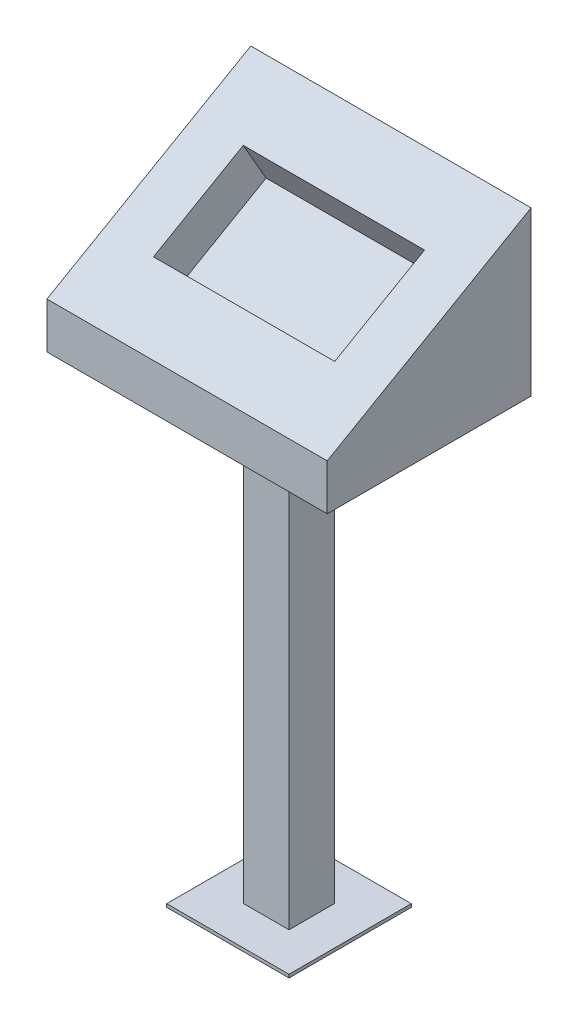
ISO-10303-21;
HEADER;
FILE_DESCRIPTION(('STEP AP214'),'2;1');
FILE_NAME('part.step','',(''),(''),'','','');
FILE_SCHEMA(('AUTOMOTIVE_DESIGN { 1 0 10303 214 1 1 1 1 }'));
ENDSEC;
DATA;
#1=APPLICATION_CONTEXT('core data for automotive mechanical design processes');
#2=APPLICATION_PROTOCOL_DEFINITION('international standard','automotive_design',2000,#1);
#3=PRODUCT_CONTEXT('',#1,'mechanical');
#4=PRODUCT('Part','Part','',(#3));
#5=PRODUCT_RELATED_PRODUCT_CATEGORY('part','',(#4));
#6=PRODUCT_DEFINITION_FORMATION('','',#4);
#7=PRODUCT_DEFINITION_CONTEXT('part definition',#1,'design');
#8=PRODUCT_DEFINITION('design','',#6,#7);
#9=PRODUCT_DEFINITION_SHAPE('','',#8);
#10=(LENGTH_UNIT() NAMED_UNIT(*) SI_UNIT(.MILLI.,.METRE.));
#11=(NAMED_UNIT(*) PLANE_ANGLE_UNIT() SI_UNIT($,.RADIAN.));
#12=(NAMED_UNIT(*) SI_UNIT($,.STERADIAN.) SOLID_ANGLE_UNIT());
#13=UNCERTAINTY_MEASURE_WITH_UNIT(LENGTH_MEASURE(1.E-05),#10,'distance_accuracy_value','');
#14=(GEOMETRIC_REPRESENTATION_CONTEXT(3) GLOBAL_UNCERTAINTY_ASSIGNED_CONTEXT((#13)) GLOBAL_UNIT_ASSIGNED_CONTEXT((#10,
#11,#12)) REPRESENTATION_CONTEXT('',''));
#15=CARTESIAN_POINT('',(0.,0.,0.));
#16=DIRECTION('',(0.,0.,1.));
#17=DIRECTION('',(1.,0.,0.));
#18=AXIS2_PLACEMENT_3D('',#15,#16,#17);
#19=CARTESIAN_POINT('',(0.,6.35,0.));
#20=DIRECTION('',(0.,-1.,0.));
#21=DIRECTION('',(0.,0.,-1.));
#22=AXIS2_PLACEMENT_3D('',#19,#20,#21);
#23=PLANE('',#22);
#24=DIRECTION('',(0.,0.,1.));
#25=VECTOR('',#24,1.);
#26=CARTESIAN_POINT('',(0.,6.35,0.));
#27=LINE('',#26,#25);
#28=CARTESIAN_POINT('',(0.,6.35,-240.));
#29=VERTEX_POINT('',#28);
#30=CARTESIAN_POINT('',(0.,6.35,0.));
#31=VERTEX_POINT('',#30);
#32=EDGE_CURVE('E251',#29,#31,#27,.T.);
#33=ORIENTED_EDGE('',*,*,#32,.T.);
#34=DIRECTION('',(1.,0.,0.));
#35=VECTOR('',#34,1.);
#36=CARTESIAN_POINT('',(0.,6.35,0.));
#37=LINE('',#36,#35);
#38=CARTESIAN_POINT('',(240.,6.35,0.));
#39=VERTEX_POINT('',#38);
#40=EDGE_CURVE('E254',#31,#39,#37,.T.);
#41=ORIENTED_EDGE('',*,*,#40,.T.);
#42=DIRECTION('',(0.,0.,-1.));
#43=VECTOR('',#42,1.);
#44=CARTESIAN_POINT('',(240.,6.35,0.));
#45=LINE('',#44,#43);
#46=CARTESIAN_POINT('',(240.,6.35,-240.));
#47=VERTEX_POINT('',#46);
#48=EDGE_CURVE('E257',#39,#47,#45,.T.);
#49=ORIENTED_EDGE('',*,*,#48,.T.);
#50=DIRECTION('',(-1.,0.,0.));
#51=VECTOR('',#50,1.);
#52=CARTESIAN_POINT('',(0.,6.35,-240.));
#53=LINE('',#52,#51);
#54=EDGE_CURVE('E259',#47,#29,#53,.T.);
#55=ORIENTED_EDGE('',*,*,#54,.T.);
#56=EDGE_LOOP('',(#33,#41,#49,#55));
#57=FACE_BOUND('',#56,.T.);
#58=DIRECTION('',(0.,0.,1.));
#59=VECTOR('',#58,1.);
#60=CARTESIAN_POINT('',(75.55,6.35,-75.55));
#61=LINE('',#60,#59);
#62=CARTESIAN_POINT('',(75.55,6.35,-164.45));
#63=VERTEX_POINT('',#62);
#64=CARTESIAN_POINT('',(75.55,6.35,-75.55));
#65=VERTEX_POINT('',#64);
#66=EDGE_CURVE('E217',#63,#65,#61,.T.);
#67=ORIENTED_EDGE('',*,*,#66,.F.);
#68=DIRECTION('',(-1.,0.,0.));
#69=VECTOR('',#68,1.);
#70=CARTESIAN_POINT('',(164.45,6.35,-164.45));
#71=LINE('',#70,#69);
#72=CARTESIAN_POINT('',(164.45,6.35,-164.45));
#73=VERTEX_POINT('',#72);
#74=EDGE_CURVE('E222',#73,#63,#71,.T.);
#75=ORIENTED_EDGE('',*,*,#74,.F.);
#76=DIRECTION('',(0.,0.,-1.));
#77=VECTOR('',#76,1.);
#78=CARTESIAN_POINT('',(164.45,6.35,-75.55));
#79=LINE('',#78,#77);
#80=CARTESIAN_POINT('',(164.45,6.35,-75.55));
#81=VERTEX_POINT('',#80);
#82=EDGE_CURVE('E235',#81,#73,#79,.T.);
#83=ORIENTED_EDGE('',*,*,#82,.F.);
#84=DIRECTION('',(1.,0.,0.));
#85=VECTOR('',#84,1.);
#86=CARTESIAN_POINT('',(164.45,6.35,-75.55));
#87=LINE('',#86,#85);
#88=EDGE_CURVE('E59',#65,#81,#87,.T.);
#89=ORIENTED_EDGE('',*,*,#88,.F.);
#90=EDGE_LOOP('',(#67,#75,#83,#89));
#91=FACE_BOUND('',#90,.T.);
#92=ADVANCED_FACE('F36',(#57,#91),#23,.F.);
#93=CARTESIAN_POINT('',(0.,6.35,0.));
#94=DIRECTION('',(1.,0.,0.));
#95=DIRECTION('',(0.,0.,-1.));
#96=AXIS2_PLACEMENT_3D('',#93,#94,#95);
#97=PLANE('',#96);
#98=DIRECTION('',(0.,0.,1.));
#99=VECTOR('',#98,1.);
#100=CARTESIAN_POINT('',(0.,0.,0.));
#101=LINE('',#100,#99);
#102=CARTESIAN_POINT('',(0.,0.,-240.));
#103=VERTEX_POINT('',#102);
#104=CARTESIAN_POINT('',(0.,0.,0.));
#105=VERTEX_POINT('',#104);
#106=EDGE_CURVE('E250',#103,#105,#101,.T.);
#107=ORIENTED_EDGE('',*,*,#106,.T.);
#108=DIRECTION('',(0.,-1.,0.));
#109=VECTOR('',#108,1.);
#110=CARTESIAN_POINT('',(0.,6.35,0.));
#111=LINE('',#110,#109);
#112=EDGE_CURVE('E11',#31,#105,#111,.T.);
#113=ORIENTED_EDGE('',*,*,#112,.F.);
#114=ORIENTED_EDGE('',*,*,#32,.F.);
#115=DIRECTION('',(0.,-1.,0.));
#116=VECTOR('',#115,1.);
#117=CARTESIAN_POINT('',(0.,6.35,-240.));
#118=LINE('',#117,#116);
#119=EDGE_CURVE('E261',#29,#103,#118,.T.);
#120=ORIENTED_EDGE('',*,*,#119,.T.);
#121=EDGE_LOOP('',(#107,#113,#114,#120));
#122=FACE_BOUND('',#121,.T.);
#123=ADVANCED_FACE('F38',(#122),#97,.F.);
#124=CARTESIAN_POINT('',(0.,6.35,0.));
#125=DIRECTION('',(0.,0.,-1.));
#126=DIRECTION('',(-1.,0.,0.));
#127=AXIS2_PLACEMENT_3D('',#124,#125,#126);
#128=PLANE('',#127);
#129=DIRECTION('',(1.,0.,0.));
#130=VECTOR('',#129,1.);
#131=CARTESIAN_POINT('',(0.,0.,0.));
#132=LINE('',#131,#130);
#133=CARTESIAN_POINT('',(240.,0.,0.));
#134=VERTEX_POINT('',#133);
#135=EDGE_CURVE('E264',#105,#134,#132,.T.);
#136=ORIENTED_EDGE('',*,*,#135,.T.);
#137=DIRECTION('',(0.,-1.,0.));
#138=VECTOR('',#137,1.);
#139=CARTESIAN_POINT('',(240.,6.35,0.));
#140=LINE('',#139,#138);
#141=EDGE_CURVE('E44',#39,#134,#140,.T.);
#142=ORIENTED_EDGE('',*,*,#141,.F.);
#143=ORIENTED_EDGE('',*,*,#40,.F.);
#144=ORIENTED_EDGE('',*,*,#112,.T.);
#145=EDGE_LOOP('',(#136,#142,#143,#144));
#146=FACE_BOUND('',#145,.T.);
#147=ADVANCED_FACE('F293',(#146),#128,.F.);
#148=CARTESIAN_POINT('',(240.,6.35,0.));
#149=DIRECTION('',(-1.,0.,0.));
#150=DIRECTION('',(0.,0.,1.));
#151=AXIS2_PLACEMENT_3D('',#148,#149,#150);
#152=PLANE('',#151);
#153=DIRECTION('',(0.,0.,-1.));
#154=VECTOR('',#153,1.);
#155=CARTESIAN_POINT('',(240.,0.,0.));
#156=LINE('',#155,#154);
#157=CARTESIAN_POINT('',(240.,0.,-240.));
#158=VERTEX_POINT('',#157);
#159=EDGE_CURVE('E266',#134,#158,#156,.T.);
#160=ORIENTED_EDGE('',*,*,#159,.T.);
#161=DIRECTION('',(0.,-1.,0.));
#162=VECTOR('',#161,1.);
#163=CARTESIAN_POINT('',(240.,6.35,-240.));
#164=LINE('',#163,#162);
#165=EDGE_CURVE('E271',#47,#158,#164,.T.);
#166=ORIENTED_EDGE('',*,*,#165,.F.);
#167=ORIENTED_EDGE('',*,*,#48,.F.);
#168=ORIENTED_EDGE('',*,*,#141,.T.);
#169=EDGE_LOOP('',(#160,#166,#167,#168));
#170=FACE_BOUND('',#169,.T.);
#171=ADVANCED_FACE('F278',(#170),#152,.F.);
#172=CARTESIAN_POINT('',(0.,6.35,-240.));
#173=DIRECTION('',(0.,0.,1.));
#174=DIRECTION('',(1.,0.,0.));
#175=AXIS2_PLACEMENT_3D('',#172,#173,#174);
#176=PLANE('',#175);
#177=DIRECTION('',(-1.,0.,0.));
#178=VECTOR('',#177,1.);
#179=CARTESIAN_POINT('',(0.,0.,-240.));
#180=LINE('',#179,#178);
#181=EDGE_CURVE('E255',#158,#103,#180,.T.);
#182=ORIENTED_EDGE('',*,*,#181,.T.);
#183=ORIENTED_EDGE('',*,*,#119,.F.);
#184=ORIENTED_EDGE('',*,*,#54,.F.);
#185=ORIENTED_EDGE('',*,*,#165,.T.);
#186=EDGE_LOOP('',(#182,#183,#184,#185));
#187=FACE_BOUND('',#186,.T.);
#188=ADVANCED_FACE('F287',(#187),#176,.F.);
#189=CARTESIAN_POINT('',(0.,0.,0.));
#190=DIRECTION('',(0.,-1.,0.));
#191=DIRECTION('',(0.,0.,-1.));
#192=AXIS2_PLACEMENT_3D('',#189,#190,#191);
#193=PLANE('',#192);
#194=ORIENTED_EDGE('',*,*,#106,.F.);
#195=ORIENTED_EDGE('',*,*,#181,.F.);
#196=ORIENTED_EDGE('',*,*,#159,.F.);
#197=ORIENTED_EDGE('',*,*,#135,.F.);
#198=EDGE_LOOP('',(#194,#195,#196,#197));
#199=FACE_BOUND('',#198,.T.);
#200=ADVANCED_FACE('F284',(#199),#193,.T.);
#201=CARTESIAN_POINT('',(75.55,906.35,-75.55));
#202=DIRECTION('',(1.,0.,0.));
#203=DIRECTION('',(0.,0.,-1.));
#204=AXIS2_PLACEMENT_3D('',#201,#202,#203);
#205=PLANE('',#204);
#206=ORIENTED_EDGE('',*,*,#66,.T.);
#207=DIRECTION('',(0.,-1.,0.));
#208=VECTOR('',#207,1.);
#209=CARTESIAN_POINT('',(75.55,906.35,-75.55));
#210=LINE('',#209,#208);
#211=CARTESIAN_POINT('',(75.55,906.35,-75.55));
#212=VERTEX_POINT('',#211);
#213=EDGE_CURVE('E248',#212,#65,#210,.T.);
#214=ORIENTED_EDGE('',*,*,#213,.F.);
#215=DIRECTION('',(0.,0.,1.));
#216=VECTOR('',#215,1.);
#217=CARTESIAN_POINT('',(75.55,906.35,-75.55));
#218=LINE('',#217,#216);
#219=CARTESIAN_POINT('',(75.55,906.35,-164.45));
#220=VERTEX_POINT('',#219);
#221=EDGE_CURVE('E218',#220,#212,#218,.T.);
#222=ORIENTED_EDGE('',*,*,#221,.F.);
#223=DIRECTION('',(0.,-1.,0.));
#224=VECTOR('',#223,1.);
#225=CARTESIAN_POINT('',(75.55,906.35,-164.45));
#226=LINE('',#225,#224);
#227=EDGE_CURVE('E231',#220,#63,#226,.T.);
#228=ORIENTED_EDGE('',*,*,#227,.T.);
#229=EDGE_LOOP('',(#206,#214,#222,#228));
#230=FACE_BOUND('',#229,.T.);
#231=ADVANCED_FACE('F306',(#230),#205,.F.);
#232=CARTESIAN_POINT('',(164.45,906.35,-75.55));
#233=DIRECTION('',(0.,0.,-1.));
#234=DIRECTION('',(-1.,0.,0.));
#235=AXIS2_PLACEMENT_3D('',#232,#233,#234);
#236=PLANE('',#235);
#237=ORIENTED_EDGE('',*,*,#88,.T.);
#238=DIRECTION('',(0.,-1.,0.));
#239=VECTOR('',#238,1.);
#240=CARTESIAN_POINT('',(164.45,906.35,-75.55));
#241=LINE('',#240,#239);
#242=CARTESIAN_POINT('',(164.45,906.35,-75.55));
#243=VERTEX_POINT('',#242);
#244=EDGE_CURVE('E245',#243,#81,#241,.T.);
#245=ORIENTED_EDGE('',*,*,#244,.F.);
#246=DIRECTION('',(1.,0.,0.));
#247=VECTOR('',#246,1.);
#248=CARTESIAN_POINT('',(164.45,906.35,-75.55));
#249=LINE('',#248,#247);
#250=EDGE_CURVE('E221',#212,#243,#249,.T.);
#251=ORIENTED_EDGE('',*,*,#250,.F.);
#252=ORIENTED_EDGE('',*,*,#213,.T.);
#253=EDGE_LOOP('',(#237,#245,#251,#252));
#254=FACE_BOUND('',#253,.T.);
#255=ADVANCED_FACE('F325',(#254),#236,.F.);
#256=CARTESIAN_POINT('',(164.45,906.35,-75.55));
#257=DIRECTION('',(-1.,0.,0.));
#258=DIRECTION('',(0.,0.,1.));
#259=AXIS2_PLACEMENT_3D('',#256,#257,#258);
#260=PLANE('',#259);
#261=ORIENTED_EDGE('',*,*,#82,.T.);
#262=DIRECTION('',(0.,-1.,0.));
#263=VECTOR('',#262,1.);
#264=CARTESIAN_POINT('',(164.45,906.35,-164.45));
#265=LINE('',#264,#263);
#266=CARTESIAN_POINT('',(164.45,906.35,-164.45));
#267=VERTEX_POINT('',#266);
#268=EDGE_CURVE('E242',#267,#73,#265,.T.);
#269=ORIENTED_EDGE('',*,*,#268,.F.);
#270=DIRECTION('',(0.,0.,-1.));
#271=VECTOR('',#270,1.);
#272=CARTESIAN_POINT('',(164.45,906.35,-75.55));
#273=LINE('',#272,#271);
#274=EDGE_CURVE('E225',#243,#267,#273,.T.);
#275=ORIENTED_EDGE('',*,*,#274,.F.);
#276=ORIENTED_EDGE('',*,*,#244,.T.);
#277=EDGE_LOOP('',(#261,#269,#275,#276));
#278=FACE_BOUND('',#277,.T.);
#279=ADVANCED_FACE('F332',(#278),#260,.F.);
#280=CARTESIAN_POINT('',(164.45,906.35,-164.45));
#281=DIRECTION('',(0.,0.,1.));
#282=DIRECTION('',(1.,0.,0.));
#283=AXIS2_PLACEMENT_3D('',#280,#281,#282);
#284=PLANE('',#283);
#285=ORIENTED_EDGE('',*,*,#74,.T.);
#286=ORIENTED_EDGE('',*,*,#227,.F.);
#287=DIRECTION('',(-1.,0.,0.));
#288=VECTOR('',#287,1.);
#289=CARTESIAN_POINT('',(164.45,906.35,-164.45));
#290=LINE('',#289,#288);
#291=EDGE_CURVE('E228',#267,#220,#290,.T.);
#292=ORIENTED_EDGE('',*,*,#291,.F.);
#293=ORIENTED_EDGE('',*,*,#268,.T.);
#294=EDGE_LOOP('',(#285,#286,#292,#293));
#295=FACE_BOUND('',#294,.T.);
#296=ADVANCED_FACE('F339',(#295),#284,.F.);
#297=CARTESIAN_POINT('',(0.,906.35,0.));
#298=DIRECTION('',(0.,-1.,0.));
#299=DIRECTION('',(0.,0.,-1.));
#300=AXIS2_PLACEMENT_3D('',#297,#298,#299);
#301=PLANE('',#300);
#302=DIRECTION('',(0.,0.,-1.));
#303=VECTOR('',#302,1.);
#304=CARTESIAN_POINT('',(395.,906.35,80.));
#305=LINE('',#304,#303);
#306=CARTESIAN_POINT('',(395.,906.35,80.));
#307=VERTEX_POINT('',#306);
#308=CARTESIAN_POINT('',(395.,906.35,-320.));
#309=VERTEX_POINT('',#308);
#310=EDGE_CURVE('E194',#307,#309,#305,.T.);
#311=ORIENTED_EDGE('',*,*,#310,.F.);
#312=DIRECTION('',(1.,0.,0.));
#313=VECTOR('',#312,1.);
#314=CARTESIAN_POINT('',(-155.,906.35,80.));
#315=LINE('',#314,#313);
#316=CARTESIAN_POINT('',(-155.,906.35,80.));
#317=VERTEX_POINT('',#316);
#318=EDGE_CURVE('E198',#317,#307,#315,.T.);
#319=ORIENTED_EDGE('',*,*,#318,.F.);
#320=DIRECTION('',(0.,0.,1.));
#321=VECTOR('',#320,1.);
#322=CARTESIAN_POINT('',(-155.,906.35,80.));
#323=LINE('',#322,#321);
#324=CARTESIAN_POINT('',(-155.,906.35,-320.));
#325=VERTEX_POINT('',#324);
#326=EDGE_CURVE('E203',#325,#317,#323,.T.);
#327=ORIENTED_EDGE('',*,*,#326,.F.);
#328=DIRECTION('',(-1.,0.,0.));
#329=VECTOR('',#328,1.);
#330=CARTESIAN_POINT('',(-155.,906.35,-320.));
#331=LINE('',#330,#329);
#332=EDGE_CURVE('E201',#309,#325,#331,.T.);
#333=ORIENTED_EDGE('',*,*,#332,.F.);
#334=EDGE_LOOP('',(#311,#319,#327,#333));
#335=FACE_BOUND('',#334,.T.);
#336=ORIENTED_EDGE('',*,*,#221,.T.);
#337=ORIENTED_EDGE('',*,*,#250,.T.);
#338=ORIENTED_EDGE('',*,*,#274,.T.);
#339=ORIENTED_EDGE('',*,*,#291,.T.);
#340=EDGE_LOOP('',(#336,#337,#338,#339));
#341=FACE_BOUND('',#340,.T.);
#342=ADVANCED_FACE('F347',(#335,#341),#301,.T.);
#343=CARTESIAN_POINT('',(395.,1226.35,80.));
#344=DIRECTION('',(-1.,0.,0.));
#345=DIRECTION('',(0.,0.,1.));
#346=AXIS2_PLACEMENT_3D('',#343,#344,#345);
#347=PLANE('',#346);
#348=DIRECTION('',(0.,-1.,0.));
#349=VECTOR('',#348,1.);
#350=CARTESIAN_POINT('',(395.,1226.35,-320.));
#351=LINE('',#350,#349);
#352=CARTESIAN_POINT('',(395.,1226.35,-320.));
#353=VERTEX_POINT('',#352);
#354=EDGE_CURVE('E214',#353,#309,#351,.T.);
#355=ORIENTED_EDGE('',*,*,#354,.F.);
#356=DIRECTION('',(0.,0.498471124258083,-0.866906303057535));
#357=VECTOR('',#356,1.);
#358=CARTESIAN_POINT('',(395.,1226.35,-320.));
#359=LINE('',#358,#357);
#360=CARTESIAN_POINT('',(395.,996.35,80.));
#361=VERTEX_POINT('',#360);
#362=EDGE_CURVE('E192',#361,#353,#359,.T.);
#363=ORIENTED_EDGE('',*,*,#362,.F.);
#364=DIRECTION('',(0.,-1.,0.));
#365=VECTOR('',#364,1.);
#366=CARTESIAN_POINT('',(395.,1226.35,80.));
#367=LINE('',#366,#365);
#368=EDGE_CURVE('E197',#361,#307,#367,.T.);
#369=ORIENTED_EDGE('',*,*,#368,.T.);
#370=ORIENTED_EDGE('',*,*,#310,.T.);
#371=EDGE_LOOP('',(#355,#363,#369,#370));
#372=FACE_BOUND('',#371,.T.);
#373=ADVANCED_FACE('F355',(#372),#347,.F.);
#374=CARTESIAN_POINT('',(-155.,1226.35,-320.));
#375=DIRECTION('',(0.,0.,1.));
#376=DIRECTION('',(1.,0.,0.));
#377=AXIS2_PLACEMENT_3D('',#374,#375,#376);
#378=PLANE('',#377);
#379=ORIENTED_EDGE('',*,*,#332,.T.);
#380=DIRECTION('',(0.,-1.,0.));
#381=VECTOR('',#380,1.);
#382=CARTESIAN_POINT('',(-155.,1226.35,-320.));
#383=LINE('',#382,#381);
#384=CARTESIAN_POINT('',(-155.,1226.35,-320.));
#385=VERTEX_POINT('',#384);
#386=EDGE_CURVE('E211',#385,#325,#383,.T.);
#387=ORIENTED_EDGE('',*,*,#386,.F.);
#388=DIRECTION('',(-1.,0.,0.));
#389=VECTOR('',#388,1.);
#390=CARTESIAN_POINT('',(-155.,1226.35,-320.));
#391=LINE('',#390,#389);
#392=EDGE_CURVE('E195',#353,#385,#391,.T.);
#393=ORIENTED_EDGE('',*,*,#392,.F.);
#394=ORIENTED_EDGE('',*,*,#354,.T.);
#395=EDGE_LOOP('',(#379,#387,#393,#394));
#396=FACE_BOUND('',#395,.T.);
#397=ADVANCED_FACE('F363',(#396),#378,.F.);
#398=CARTESIAN_POINT('',(-155.,1226.35,80.));
#399=DIRECTION('',(1.,0.,0.));
#400=DIRECTION('',(0.,0.,-1.));
#401=AXIS2_PLACEMENT_3D('',#398,#399,#400);
#402=PLANE('',#401);
#403=DIRECTION('',(0.,-1.,0.));
#404=VECTOR('',#403,1.);
#405=CARTESIAN_POINT('',(-155.,1226.35,80.));
#406=LINE('',#405,#404);
#407=CARTESIAN_POINT('',(-155.,996.35,80.));
#408=VERTEX_POINT('',#407);
#409=EDGE_CURVE('E209',#408,#317,#406,.T.);
#410=ORIENTED_EDGE('',*,*,#409,.F.);
#411=DIRECTION('',(0.,-0.498471124258083,0.866906303057535));
#412=VECTOR('',#411,1.);
#413=CARTESIAN_POINT('',(-155.,1226.35,-320.));
#414=LINE('',#413,#412);
#415=EDGE_CURVE('E184',#385,#408,#414,.T.);
#416=ORIENTED_EDGE('',*,*,#415,.F.);
#417=ORIENTED_EDGE('',*,*,#386,.T.);
#418=ORIENTED_EDGE('',*,*,#326,.T.);
#419=EDGE_LOOP('',(#410,#416,#417,#418));
#420=FACE_BOUND('',#419,.T.);
#421=ADVANCED_FACE('F371',(#420),#402,.F.);
#422=CARTESIAN_POINT('',(-155.,1226.35,80.));
#423=DIRECTION('',(0.,0.,-1.));
#424=DIRECTION('',(-1.,0.,0.));
#425=AXIS2_PLACEMENT_3D('',#422,#423,#424);
#426=PLANE('',#425);
#427=ORIENTED_EDGE('',*,*,#368,.F.);
#428=DIRECTION('',(-1.,0.,0.));
#429=VECTOR('',#428,1.);
#430=CARTESIAN_POINT('',(856.410879802373,996.35,80.));
#431=LINE('',#430,#429);
#432=EDGE_CURVE('E189',#361,#408,#431,.T.);
#433=ORIENTED_EDGE('',*,*,#432,.T.);
#434=ORIENTED_EDGE('',*,*,#409,.T.);
#435=ORIENTED_EDGE('',*,*,#318,.T.);
#436=EDGE_LOOP('',(#427,#433,#434,#435));
#437=FACE_BOUND('',#436,.T.);
#438=ADVANCED_FACE('F379',(#437),#426,.F.);
#439=CARTESIAN_POINT('',(856.410879802373,1226.35,-320.));
#440=DIRECTION('',(0.,-0.866906303057535,-0.498471124258083));
#441=DIRECTION('',(0.,0.498471124258083,-0.866906303057535));
#442=AXIS2_PLACEMENT_3D('',#439,#440,#441);
#443=PLANE('',#442);
#444=DIRECTION('',(-1.,0.,0.));
#445=VECTOR('',#444,1.);
#446=CARTESIAN_POINT('',(-57.8,1161.99466622462,-208.077680390646));
#447=LINE('',#446,#445);
#448=CARTESIAN_POINT('',(297.8,1161.99466622462,-208.077680390646));
#449=VERTEX_POINT('',#448);
#450=CARTESIAN_POINT('',(-57.8,1161.99466622462,-208.077680390646));
#451=VERTEX_POINT('',#450);
#452=EDGE_CURVE('E178',#449,#451,#447,.T.);
#453=ORIENTED_EDGE('',*,*,#452,.F.);
#454=DIRECTION('',(0.,0.498471124258082,-0.866906303057535));
#455=VECTOR('',#454,1.);
#456=CARTESIAN_POINT('',(297.8,1060.70533377538,-31.9223196093545));
#457=LINE('',#456,#455);
#458=CARTESIAN_POINT('',(297.8,1060.70533377538,-31.9223196093545));
#459=VERTEX_POINT('',#458);
#460=EDGE_CURVE('E51',#459,#449,#457,.T.);
#461=ORIENTED_EDGE('',*,*,#460,.F.);
#462=DIRECTION('',(1.,0.,0.));
#463=VECTOR('',#462,1.);
#464=CARTESIAN_POINT('',(-57.8,1060.70533377538,-31.9223196093545));
#465=LINE('',#464,#463);
#466=CARTESIAN_POINT('',(-57.8,1060.70533377538,-31.9223196093545));
#467=VERTEX_POINT('',#466);
#468=EDGE_CURVE('E169',#467,#459,#465,.T.);
#469=ORIENTED_EDGE('',*,*,#468,.F.);
#470=DIRECTION('',(0.,-0.498471124258082,0.866906303057535));
#471=VECTOR('',#470,1.);
#472=CARTESIAN_POINT('',(-57.8,1060.70533377538,-31.9223196093545));
#473=LINE('',#472,#471);
#474=EDGE_CURVE('E172',#451,#467,#473,.T.);
#475=ORIENTED_EDGE('',*,*,#474,.F.);
#476=EDGE_LOOP('',(#453,#461,#469,#475));
#477=FACE_BOUND('',#476,.T.);
#478=ORIENTED_EDGE('',*,*,#362,.T.);
#479=ORIENTED_EDGE('',*,*,#392,.T.);
#480=ORIENTED_EDGE('',*,*,#415,.T.);
#481=ORIENTED_EDGE('',*,*,#432,.F.);
#482=EDGE_LOOP('',(#478,#479,#480,#481));
#483=FACE_BOUND('',#482,.T.);
#484=ADVANCED_FACE('F387',(#477,#483),#443,.F.);
#485=CARTESIAN_POINT('',(297.8,982.683766500201,-76.7847207925819));
#486=DIRECTION('',(1.,0.,0.));
#487=DIRECTION('',(0.,0.,-1.));
#488=AXIS2_PLACEMENT_3D('',#485,#486,#487);
#489=PLANE('',#488);
#490=ORIENTED_EDGE('',*,*,#460,.T.);
#491=DIRECTION('',(0.,0.866906303057535,0.498471124258083));
#492=VECTOR('',#491,1.);
#493=CARTESIAN_POINT('',(297.8,1083.97309894944,-252.940081573873));
#494=LINE('',#493,#492);
#495=CARTESIAN_POINT('',(297.8,1083.97309894944,-252.940081573873));
#496=VERTEX_POINT('',#495);
#497=EDGE_CURVE('E147',#496,#449,#494,.T.);
#498=ORIENTED_EDGE('',*,*,#497,.F.);
#499=DIRECTION('',(0.,0.498471124258082,-0.866906303057535));
#500=VECTOR('',#499,1.);
#501=CARTESIAN_POINT('',(297.8,982.683766500201,-76.7847207925819));
#502=LINE('',#501,#500);
#503=CARTESIAN_POINT('',(297.8,982.683766500201,-76.7847207925819));
#504=VERTEX_POINT('',#503);
#505=EDGE_CURVE('E151',#504,#496,#502,.T.);
#506=ORIENTED_EDGE('',*,*,#505,.F.);
#507=DIRECTION('',(0.,0.866906303057535,0.498471124258083));
#508=VECTOR('',#507,1.);
#509=CARTESIAN_POINT('',(297.8,982.683766500201,-76.7847207925819));
#510=LINE('',#509,#508);
#511=EDGE_CURVE('E182',#504,#459,#510,.T.);
#512=ORIENTED_EDGE('',*,*,#511,.T.);
#513=EDGE_LOOP('',(#490,#498,#506,#512));
#514=FACE_BOUND('',#513,.T.);
#515=ADVANCED_FACE('F149',(#514),#489,.F.);
#516=CARTESIAN_POINT('',(-57.8,982.683766500201,-76.7847207925819));
#517=DIRECTION('',(0.,-0.498471124258083,0.866906303057535));
#518=DIRECTION('',(0.,-0.866906303057535,-0.498471124258083));
#519=AXIS2_PLACEMENT_3D('',#516,#517,#518);
#520=PLANE('',#519);
#521=ORIENTED_EDGE('',*,*,#468,.T.);
#522=ORIENTED_EDGE('',*,*,#511,.F.);
#523=DIRECTION('',(1.,0.,0.));
#524=VECTOR('',#523,1.);
#525=CARTESIAN_POINT('',(-57.8,982.683766500201,-76.7847207925819));
#526=LINE('',#525,#524);
#527=CARTESIAN_POINT('',(-57.8,982.683766500201,-76.7847207925819));
#528=VERTEX_POINT('',#527);
#529=EDGE_CURVE('E157',#528,#504,#526,.T.);
#530=ORIENTED_EDGE('',*,*,#529,.F.);
#531=DIRECTION('',(0.,0.866906303057535,0.498471124258083));
#532=VECTOR('',#531,1.);
#533=CARTESIAN_POINT('',(-57.8,982.683766500201,-76.7847207925819));
#534=LINE('',#533,#532);
#535=EDGE_CURVE('E185',#528,#467,#534,.T.);
#536=ORIENTED_EDGE('',*,*,#535,.T.);
#537=EDGE_LOOP('',(#521,#522,#530,#536));
#538=FACE_BOUND('',#537,.T.);
#539=ADVANCED_FACE('F402',(#538),#520,.F.);
#540=CARTESIAN_POINT('',(-57.8,982.683766500201,-76.7847207925819));
#541=DIRECTION('',(-1.,0.,0.));
#542=DIRECTION('',(0.,0.,1.));
#543=AXIS2_PLACEMENT_3D('',#540,#541,#542);
#544=PLANE('',#543);
#545=ORIENTED_EDGE('',*,*,#474,.T.);
#546=ORIENTED_EDGE('',*,*,#535,.F.);
#547=DIRECTION('',(0.,-0.498471124258082,0.866906303057535));
#548=VECTOR('',#547,1.);
#549=CARTESIAN_POINT('',(-57.8,982.683766500201,-76.7847207925819));
#550=LINE('',#549,#548);
#551=CARTESIAN_POINT('',(-57.8,1083.97309894944,-252.940081573873));
#552=VERTEX_POINT('',#551);
#553=EDGE_CURVE('E165',#552,#528,#550,.T.);
#554=ORIENTED_EDGE('',*,*,#553,.F.);
#555=DIRECTION('',(0.,0.866906303057535,0.498471124258083));
#556=VECTOR('',#555,1.);
#557=CARTESIAN_POINT('',(-57.8,1083.97309894944,-252.940081573873));
#558=LINE('',#557,#556);
#559=EDGE_CURVE('E156',#552,#451,#558,.T.);
#560=ORIENTED_EDGE('',*,*,#559,.T.);
#561=EDGE_LOOP('',(#545,#546,#554,#560));
#562=FACE_BOUND('',#561,.T.);
#563=ADVANCED_FACE('F409',(#562),#544,.F.);
#564=CARTESIAN_POINT('',(-57.8,1083.97309894944,-252.940081573873));
#565=DIRECTION('',(0.,0.498471124258083,-0.866906303057535));
#566=DIRECTION('',(0.,0.866906303057535,0.498471124258083));
#567=AXIS2_PLACEMENT_3D('',#564,#565,#566);
#568=PLANE('',#567);
#569=ORIENTED_EDGE('',*,*,#452,.T.);
#570=ORIENTED_EDGE('',*,*,#559,.F.);
#571=DIRECTION('',(-1.,0.,0.));
#572=VECTOR('',#571,1.);
#573=CARTESIAN_POINT('',(-57.8,1083.97309894944,-252.940081573873));
#574=LINE('',#573,#572);
#575=EDGE_CURVE('E160',#496,#552,#574,.T.);
#576=ORIENTED_EDGE('',*,*,#575,.F.);
#577=ORIENTED_EDGE('',*,*,#497,.T.);
#578=EDGE_LOOP('',(#569,#570,#576,#577));
#579=FACE_BOUND('',#578,.T.);
#580=ADVANCED_FACE('F161',(#579),#568,.F.);
#581=CARTESIAN_POINT('',(0.,705.332119901901,405.565968943592));
#582=DIRECTION('',(0.,-0.866906303057535,-0.498471124258082));
#583=DIRECTION('',(0.,0.498471124258082,-0.866906303057535));
#584=AXIS2_PLACEMENT_3D('',#581,#582,#583);
#585=PLANE('',#584);
#586=ORIENTED_EDGE('',*,*,#505,.T.);
#587=ORIENTED_EDGE('',*,*,#575,.T.);
#588=ORIENTED_EDGE('',*,*,#553,.T.);
#589=ORIENTED_EDGE('',*,*,#529,.T.);
#590=EDGE_LOOP('',(#586,#587,#588,#589));
#591=FACE_BOUND('',#590,.T.);
#592=ADVANCED_FACE('F167',(#591),#585,.F.);
#593=CLOSED_SHELL('',(#92,#123,#147,#171,#188,#200,#231,#255,#279,#296,#342,#373,#397,#421,#438,
#484,#515,#539,#563,#580,#592));
#594=MANIFOLD_SOLID_BREP('B2',#593);
#595=ADVANCED_BREP_SHAPE_REPRESENTATION('',(#18,#594),#14);
#596=SHAPE_DEFINITION_REPRESENTATION(#9,#595);
ENDSEC;
END-ISO-10303-21;
